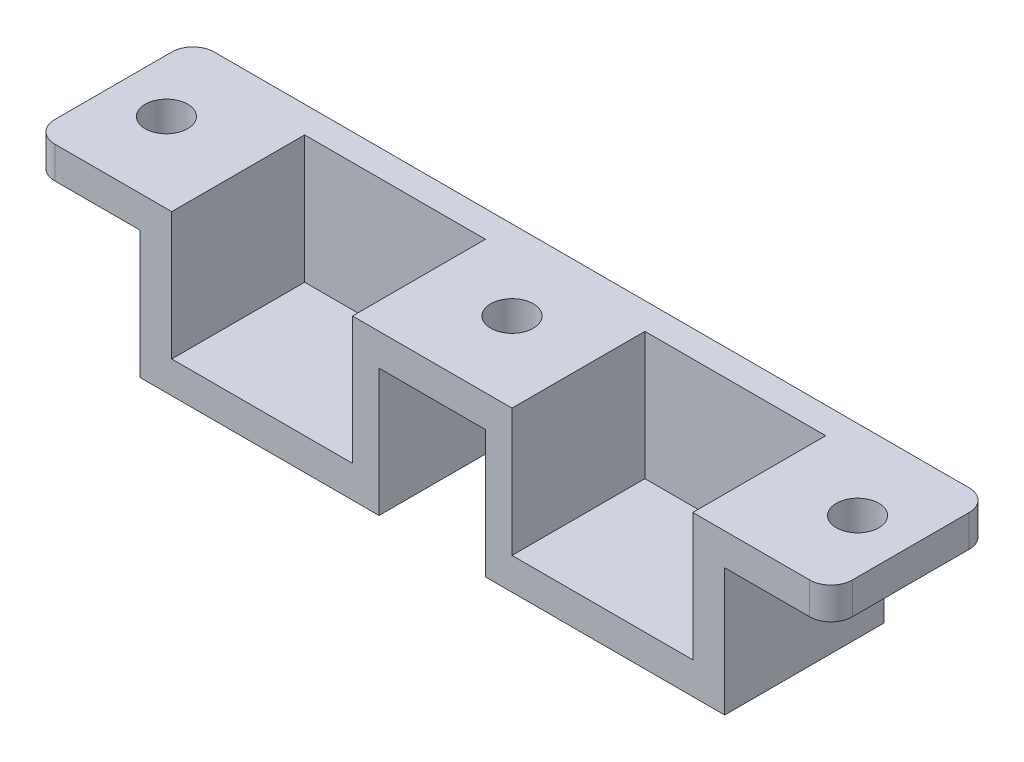
ISO-10303-21;
HEADER;
FILE_DESCRIPTION(('STEP AP214'),'2;1');
FILE_NAME('part.step','',(''),(''),'','','');
FILE_SCHEMA(('AUTOMOTIVE_DESIGN { 1 0 10303 214 1 1 1 1 }'));
ENDSEC;
DATA;
#1=APPLICATION_CONTEXT('core data for automotive mechanical design processes');
#2=APPLICATION_PROTOCOL_DEFINITION('international standard','automotive_design',2000,#1);
#3=PRODUCT_CONTEXT('',#1,'mechanical');
#4=PRODUCT('Part','Part','',(#3));
#5=PRODUCT_RELATED_PRODUCT_CATEGORY('part','',(#4));
#6=PRODUCT_DEFINITION_FORMATION('','',#4);
#7=PRODUCT_DEFINITION_CONTEXT('part definition',#1,'design');
#8=PRODUCT_DEFINITION('design','',#6,#7);
#9=PRODUCT_DEFINITION_SHAPE('','',#8);
#10=(LENGTH_UNIT() NAMED_UNIT(*) SI_UNIT(.MILLI.,.METRE.));
#11=(NAMED_UNIT(*) PLANE_ANGLE_UNIT() SI_UNIT($,.RADIAN.));
#12=(NAMED_UNIT(*) SI_UNIT($,.STERADIAN.) SOLID_ANGLE_UNIT());
#13=UNCERTAINTY_MEASURE_WITH_UNIT(LENGTH_MEASURE(1.E-05),#10,'distance_accuracy_value','');
#14=(GEOMETRIC_REPRESENTATION_CONTEXT(3) GLOBAL_UNCERTAINTY_ASSIGNED_CONTEXT((#13)) GLOBAL_UNIT_ASSIGNED_CONTEXT((#10,
#11,#12)) REPRESENTATION_CONTEXT('',''));
#15=CARTESIAN_POINT('',(0.,0.,0.));
#16=DIRECTION('',(0.,0.,1.));
#17=DIRECTION('',(1.,0.,0.));
#18=AXIS2_PLACEMENT_3D('',#15,#16,#17);
#19=CARTESIAN_POINT('',(37.5,15.,7.5));
#20=DIRECTION('',(-1.,0.,0.));
#21=DIRECTION('',(0.,0.,1.));
#22=AXIS2_PLACEMENT_3D('',#19,#20,#21);
#23=PLANE('',#22);
#24=DIRECTION('',(0.,0.,-1.));
#25=VECTOR('',#24,1.);
#26=CARTESIAN_POINT('',(37.5,15.,7.5));
#27=LINE('',#26,#25);
#28=CARTESIAN_POINT('',(37.5,15.,5.5));
#29=VERTEX_POINT('',#28);
#30=CARTESIAN_POINT('',(37.5,15.,-5.5));
#31=VERTEX_POINT('',#30);
#32=EDGE_CURVE('E334',#29,#31,#27,.T.);
#33=ORIENTED_EDGE('',*,*,#32,.F.);
#34=DIRECTION('',(0.,-1.,0.));
#35=VECTOR('',#34,1.);
#36=CARTESIAN_POINT('',(37.5,15.,5.5));
#37=LINE('',#36,#35);
#38=CARTESIAN_POINT('',(37.5,12.,5.5));
#39=VERTEX_POINT('',#38);
#40=EDGE_CURVE('E373',#29,#39,#37,.T.);
#41=ORIENTED_EDGE('',*,*,#40,.T.);
#42=DIRECTION('',(0.,0.,1.));
#43=VECTOR('',#42,1.);
#44=CARTESIAN_POINT('',(37.5,12.,-7.5));
#45=LINE('',#44,#43);
#46=CARTESIAN_POINT('',(37.5,12.,-5.5));
#47=VERTEX_POINT('',#46);
#48=EDGE_CURVE('E225',#47,#39,#45,.T.);
#49=ORIENTED_EDGE('',*,*,#48,.F.);
#50=DIRECTION('',(0.,-1.,0.));
#51=VECTOR('',#50,1.);
#52=CARTESIAN_POINT('',(37.5,15.,-5.5));
#53=LINE('',#52,#51);
#54=EDGE_CURVE('E371',#47,#31,#53,.F.);
#55=ORIENTED_EDGE('',*,*,#54,.T.);
#56=EDGE_LOOP('',(#33,#41,#49,#55));
#57=FACE_BOUND('',#56,.T.);
#58=ADVANCED_FACE('F33',(#57),#23,.F.);
#59=CARTESIAN_POINT('',(0.,0.,0.));
#60=DIRECTION('',(0.,1.,0.));
#61=DIRECTION('',(0.,0.,1.));
#62=AXIS2_PLACEMENT_3D('',#59,#60,#61);
#63=PLANE('',#62);
#64=DIRECTION('',(1.,0.,0.));
#65=VECTOR('',#64,1.);
#66=CARTESIAN_POINT('',(37.5,0.,7.5));
#67=LINE('',#66,#65);
#68=CARTESIAN_POINT('',(-27.5,0.,7.5));
#69=VERTEX_POINT('',#68);
#70=CARTESIAN_POINT('',(-5.,0.,7.5));
#71=VERTEX_POINT('',#70);
#72=EDGE_CURVE('E344',#69,#71,#67,.T.);
#73=ORIENTED_EDGE('',*,*,#72,.F.);
#74=DIRECTION('',(0.,0.,1.));
#75=VECTOR('',#74,1.);
#76=CARTESIAN_POINT('',(-27.5,0.,-7.49999999999999));
#77=LINE('',#76,#75);
#78=CARTESIAN_POINT('',(-27.5,0.,-7.49999999999999));
#79=VERTEX_POINT('',#78);
#80=EDGE_CURVE('E241',#79,#69,#77,.T.);
#81=ORIENTED_EDGE('',*,*,#80,.F.);
#82=DIRECTION('',(-1.,0.,0.));
#83=VECTOR('',#82,1.);
#84=CARTESIAN_POINT('',(37.5,0.,-7.5));
#85=LINE('',#84,#83);
#86=CARTESIAN_POINT('',(-5.,0.,-7.5));
#87=VERTEX_POINT('',#86);
#88=EDGE_CURVE('E218',#87,#79,#85,.T.);
#89=ORIENTED_EDGE('',*,*,#88,.F.);
#90=DIRECTION('',(0.,0.,-1.));
#91=VECTOR('',#90,1.);
#92=CARTESIAN_POINT('',(-5.,0.,-7.5));
#93=LINE('',#92,#91);
#94=EDGE_CURVE('E257',#71,#87,#93,.T.);
#95=ORIENTED_EDGE('',*,*,#94,.F.);
#96=EDGE_LOOP('',(#73,#81,#89,#95));
#97=FACE_BOUND('',#96,.T.);
#98=ADVANCED_FACE('F423',(#97),#63,.F.);
#99=CARTESIAN_POINT('',(-37.5,15.,7.5));
#100=DIRECTION('',(1.,0.,0.));
#101=DIRECTION('',(0.,0.,-1.));
#102=AXIS2_PLACEMENT_3D('',#99,#100,#101);
#103=PLANE('',#102);
#104=DIRECTION('',(0.,0.,1.));
#105=VECTOR('',#104,1.);
#106=CARTESIAN_POINT('',(-37.5,15.,7.5));
#107=LINE('',#106,#105);
#108=CARTESIAN_POINT('',(-37.5,15.,-5.49999999999999));
#109=VERTEX_POINT('',#108);
#110=CARTESIAN_POINT('',(-37.5,15.,5.5));
#111=VERTEX_POINT('',#110);
#112=EDGE_CURVE('E327',#109,#111,#107,.T.);
#113=ORIENTED_EDGE('',*,*,#112,.F.);
#114=DIRECTION('',(0.,-1.,0.));
#115=VECTOR('',#114,1.);
#116=CARTESIAN_POINT('',(-37.5,15.,-5.49999999999999));
#117=LINE('',#116,#115);
#118=CARTESIAN_POINT('',(-37.5,12.,-5.49999999999999));
#119=VERTEX_POINT('',#118);
#120=EDGE_CURVE('E347',#109,#119,#117,.T.);
#121=ORIENTED_EDGE('',*,*,#120,.T.);
#122=DIRECTION('',(0.,0.,-1.));
#123=VECTOR('',#122,1.);
#124=CARTESIAN_POINT('',(-37.5,12.,-7.49999999999999));
#125=LINE('',#124,#123);
#126=CARTESIAN_POINT('',(-37.5,12.,5.50000000000001));
#127=VERTEX_POINT('',#126);
#128=EDGE_CURVE('E204',#127,#119,#125,.T.);
#129=ORIENTED_EDGE('',*,*,#128,.F.);
#130=DIRECTION('',(0.,-1.,0.));
#131=VECTOR('',#130,1.);
#132=CARTESIAN_POINT('',(-37.5,15.,5.5));
#133=LINE('',#132,#131);
#134=EDGE_CURVE('E341',#127,#111,#133,.F.);
#135=ORIENTED_EDGE('',*,*,#134,.T.);
#136=EDGE_LOOP('',(#113,#121,#129,#135));
#137=FACE_BOUND('',#136,.T.);
#138=ADVANCED_FACE('F428',(#137),#103,.F.);
#139=CARTESIAN_POINT('',(37.5,15.,7.5));
#140=DIRECTION('',(0.,0.,-1.));
#141=DIRECTION('',(-1.,0.,0.));
#142=AXIS2_PLACEMENT_3D('',#139,#140,#141);
#143=PLANE('',#142);
#144=DIRECTION('',(1.,0.,0.));
#145=VECTOR('',#144,1.);
#146=CARTESIAN_POINT('',(37.5,15.,7.5));
#147=LINE('',#146,#145);
#148=CARTESIAN_POINT('',(-35.5,15.,7.5));
#149=VERTEX_POINT('',#148);
#150=CARTESIAN_POINT('',(-24.5,15.,7.5));
#151=VERTEX_POINT('',#150);
#152=EDGE_CURVE('E332',#149,#151,#147,.T.);
#153=ORIENTED_EDGE('',*,*,#152,.F.);
#154=DIRECTION('',(0.,-1.,0.));
#155=VECTOR('',#154,1.);
#156=CARTESIAN_POINT('',(-35.5,15.,7.5));
#157=LINE('',#156,#155);
#158=CARTESIAN_POINT('',(-35.5,12.,7.5));
#159=VERTEX_POINT('',#158);
#160=EDGE_CURVE('E368',#149,#159,#157,.T.);
#161=ORIENTED_EDGE('',*,*,#160,.T.);
#162=DIRECTION('',(-1.,0.,0.));
#163=VECTOR('',#162,1.);
#164=CARTESIAN_POINT('',(-37.5,12.,7.5));
#165=LINE('',#164,#163);
#166=CARTESIAN_POINT('',(-27.5,12.,7.5));
#167=VERTEX_POINT('',#166);
#168=EDGE_CURVE('E212',#167,#159,#165,.T.);
#169=ORIENTED_EDGE('',*,*,#168,.F.);
#170=DIRECTION('',(0.,-1.,0.));
#171=VECTOR('',#170,1.);
#172=CARTESIAN_POINT('',(-27.5,12.,7.5));
#173=LINE('',#172,#171);
#174=EDGE_CURVE('E211',#167,#69,#173,.T.);
#175=ORIENTED_EDGE('',*,*,#174,.T.);
#176=ORIENTED_EDGE('',*,*,#72,.T.);
#177=DIRECTION('',(0.,-1.,0.));
#178=VECTOR('',#177,1.);
#179=CARTESIAN_POINT('',(-5.,12.,7.5));
#180=LINE('',#179,#178);
#181=CARTESIAN_POINT('',(-5.,12.,7.5));
#182=VERTEX_POINT('',#181);
#183=EDGE_CURVE('E237',#182,#71,#180,.T.);
#184=ORIENTED_EDGE('',*,*,#183,.F.);
#185=DIRECTION('',(-1.,0.,0.));
#186=VECTOR('',#185,1.);
#187=CARTESIAN_POINT('',(5.,12.,7.5));
#188=LINE('',#187,#186);
#189=CARTESIAN_POINT('',(5.,12.,7.5));
#190=VERTEX_POINT('',#189);
#191=EDGE_CURVE('E253',#190,#182,#188,.T.);
#192=ORIENTED_EDGE('',*,*,#191,.F.);
#193=DIRECTION('',(0.,-1.,0.));
#194=VECTOR('',#193,1.);
#195=CARTESIAN_POINT('',(5.,12.,7.5));
#196=LINE('',#195,#194);
#197=CARTESIAN_POINT('',(5.,0.,7.5));
#198=VERTEX_POINT('',#197);
#199=EDGE_CURVE('E262',#190,#198,#196,.T.);
#200=ORIENTED_EDGE('',*,*,#199,.T.);
#201=CARTESIAN_POINT('',(27.5,0.,7.5));
#202=VERTEX_POINT('',#201);
#203=EDGE_CURVE('E293',#198,#202,#67,.T.);
#204=ORIENTED_EDGE('',*,*,#203,.T.);
#205=DIRECTION('',(0.,-1.,0.));
#206=VECTOR('',#205,1.);
#207=CARTESIAN_POINT('',(27.5,12.,7.5));
#208=LINE('',#207,#206);
#209=CARTESIAN_POINT('',(27.5,12.,7.5));
#210=VERTEX_POINT('',#209);
#211=EDGE_CURVE('E235',#210,#202,#208,.T.);
#212=ORIENTED_EDGE('',*,*,#211,.F.);
#213=DIRECTION('',(-1.,0.,0.));
#214=VECTOR('',#213,1.);
#215=CARTESIAN_POINT('',(37.5,12.,7.5));
#216=LINE('',#215,#214);
#217=CARTESIAN_POINT('',(35.5,12.,7.5));
#218=VERTEX_POINT('',#217);
#219=EDGE_CURVE('E227',#218,#210,#216,.T.);
#220=ORIENTED_EDGE('',*,*,#219,.F.);
#221=DIRECTION('',(0.,-1.,0.));
#222=VECTOR('',#221,1.);
#223=CARTESIAN_POINT('',(35.5,15.,7.5));
#224=LINE('',#223,#222);
#225=CARTESIAN_POINT('',(35.5,15.,7.5));
#226=VERTEX_POINT('',#225);
#227=EDGE_CURVE('E366',#218,#226,#224,.F.);
#228=ORIENTED_EDGE('',*,*,#227,.T.);
#229=CARTESIAN_POINT('',(24.5,15.,7.5));
#230=VERTEX_POINT('',#229);
#231=EDGE_CURVE('E330',#230,#226,#147,.T.);
#232=ORIENTED_EDGE('',*,*,#231,.F.);
#233=DIRECTION('',(0.,1.,0.));
#234=VECTOR('',#233,1.);
#235=CARTESIAN_POINT('',(24.5,3.,7.5));
#236=LINE('',#235,#234);
#237=CARTESIAN_POINT('',(24.5,3.,7.5));
#238=VERTEX_POINT('',#237);
#239=EDGE_CURVE('E323',#238,#230,#236,.T.);
#240=ORIENTED_EDGE('',*,*,#239,.F.);
#241=DIRECTION('',(1.,0.,0.));
#242=VECTOR('',#241,1.);
#243=CARTESIAN_POINT('',(7.5,3.,7.5));
#244=LINE('',#243,#242);
#245=CARTESIAN_POINT('',(7.5,3.,7.5));
#246=VERTEX_POINT('',#245);
#247=EDGE_CURVE('E303',#246,#238,#244,.T.);
#248=ORIENTED_EDGE('',*,*,#247,.F.);
#249=DIRECTION('',(0.,1.,0.));
#250=VECTOR('',#249,1.);
#251=CARTESIAN_POINT('',(7.5,3.,7.5));
#252=LINE('',#251,#250);
#253=CARTESIAN_POINT('',(7.5,15.,7.5));
#254=VERTEX_POINT('',#253);
#255=EDGE_CURVE('E313',#246,#254,#252,.T.);
#256=ORIENTED_EDGE('',*,*,#255,.T.);
#257=CARTESIAN_POINT('',(-7.5,15.,7.5));
#258=VERTEX_POINT('',#257);
#259=EDGE_CURVE('E335',#258,#254,#147,.T.);
#260=ORIENTED_EDGE('',*,*,#259,.F.);
#261=DIRECTION('',(0.,1.,0.));
#262=VECTOR('',#261,1.);
#263=CARTESIAN_POINT('',(-7.5,3.,7.5));
#264=LINE('',#263,#262);
#265=CARTESIAN_POINT('',(-7.5,3.,7.5));
#266=VERTEX_POINT('',#265);
#267=EDGE_CURVE('E296',#266,#258,#264,.T.);
#268=ORIENTED_EDGE('',*,*,#267,.F.);
#269=DIRECTION('',(1.,0.,0.));
#270=VECTOR('',#269,1.);
#271=CARTESIAN_POINT('',(-24.5,3.,7.5));
#272=LINE('',#271,#270);
#273=CARTESIAN_POINT('',(-24.5,3.,7.5));
#274=VERTEX_POINT('',#273);
#275=EDGE_CURVE('E271',#274,#266,#272,.T.);
#276=ORIENTED_EDGE('',*,*,#275,.F.);
#277=DIRECTION('',(0.,1.,0.));
#278=VECTOR('',#277,1.);
#279=CARTESIAN_POINT('',(-24.5,3.,7.5));
#280=LINE('',#279,#278);
#281=EDGE_CURVE('E281',#274,#151,#280,.T.);
#282=ORIENTED_EDGE('',*,*,#281,.T.);
#283=EDGE_LOOP('',(#153,#161,#169,#175,#176,#184,#192,#200,#204,#212,#220,#228,#232,#240,#248,
#256,#260,#268,#276,#282));
#284=FACE_BOUND('',#283,.T.);
#285=ADVANCED_FACE('F384',(#284),#143,.F.);
#286=CARTESIAN_POINT('',(37.5,15.,-7.5));
#287=DIRECTION('',(0.,0.,1.));
#288=DIRECTION('',(1.,0.,0.));
#289=AXIS2_PLACEMENT_3D('',#286,#287,#288);
#290=PLANE('',#289);
#291=DIRECTION('',(1.,0.,0.));
#292=VECTOR('',#291,1.);
#293=CARTESIAN_POINT('',(-37.5,12.,-7.49999999999999));
#294=LINE('',#293,#292);
#295=CARTESIAN_POINT('',(-35.5,12.,-7.49999999999999));
#296=VERTEX_POINT('',#295);
#297=CARTESIAN_POINT('',(-27.5,12.,-7.49999999999999));
#298=VERTEX_POINT('',#297);
#299=EDGE_CURVE('E193',#296,#298,#294,.T.);
#300=ORIENTED_EDGE('',*,*,#299,.F.);
#301=DIRECTION('',(0.,-1.,0.));
#302=VECTOR('',#301,1.);
#303=CARTESIAN_POINT('',(-35.5,15.,-7.49999999999999));
#304=LINE('',#303,#302);
#305=CARTESIAN_POINT('',(-35.5,15.,-7.49999999999999));
#306=VERTEX_POINT('',#305);
#307=EDGE_CURVE('E356',#296,#306,#304,.F.);
#308=ORIENTED_EDGE('',*,*,#307,.T.);
#309=DIRECTION('',(-1.,0.,0.));
#310=VECTOR('',#309,1.);
#311=CARTESIAN_POINT('',(37.5,15.,-7.5));
#312=LINE('',#311,#310);
#313=CARTESIAN_POINT('',(35.5,15.,-7.5));
#314=VERTEX_POINT('',#313);
#315=EDGE_CURVE('E338',#314,#306,#312,.T.);
#316=ORIENTED_EDGE('',*,*,#315,.F.);
#317=DIRECTION('',(0.,-1.,0.));
#318=VECTOR('',#317,1.);
#319=CARTESIAN_POINT('',(35.5,15.,-7.5));
#320=LINE('',#319,#318);
#321=CARTESIAN_POINT('',(35.5,12.,-7.5));
#322=VERTEX_POINT('',#321);
#323=EDGE_CURVE('E353',#314,#322,#320,.T.);
#324=ORIENTED_EDGE('',*,*,#323,.T.);
#325=DIRECTION('',(1.,0.,0.));
#326=VECTOR('',#325,1.);
#327=CARTESIAN_POINT('',(37.5,12.,-7.5));
#328=LINE('',#327,#326);
#329=CARTESIAN_POINT('',(27.5,12.,-7.49999999999999));
#330=VERTEX_POINT('',#329);
#331=EDGE_CURVE('E233',#330,#322,#328,.T.);
#332=ORIENTED_EDGE('',*,*,#331,.F.);
#333=DIRECTION('',(0.,-1.,0.));
#334=VECTOR('',#333,1.);
#335=CARTESIAN_POINT('',(27.5,12.,-7.49999999999999));
#336=LINE('',#335,#334);
#337=CARTESIAN_POINT('',(27.5,0.,-7.49999999999999));
#338=VERTEX_POINT('',#337);
#339=EDGE_CURVE('E238',#330,#338,#336,.T.);
#340=ORIENTED_EDGE('',*,*,#339,.T.);
#341=CARTESIAN_POINT('',(5.,0.,-7.5));
#342=VERTEX_POINT('',#341);
#343=EDGE_CURVE('E331',#338,#342,#85,.T.);
#344=ORIENTED_EDGE('',*,*,#343,.T.);
#345=DIRECTION('',(0.,-1.,0.));
#346=VECTOR('',#345,1.);
#347=CARTESIAN_POINT('',(5.,12.,-7.5));
#348=LINE('',#347,#346);
#349=CARTESIAN_POINT('',(5.,12.,-7.5));
#350=VERTEX_POINT('',#349);
#351=EDGE_CURVE('E265',#350,#342,#348,.T.);
#352=ORIENTED_EDGE('',*,*,#351,.F.);
#353=DIRECTION('',(1.,0.,0.));
#354=VECTOR('',#353,1.);
#355=CARTESIAN_POINT('',(5.,12.,-7.5));
#356=LINE('',#355,#354);
#357=CARTESIAN_POINT('',(-5.,12.,-7.5));
#358=VERTEX_POINT('',#357);
#359=EDGE_CURVE('E246',#358,#350,#356,.T.);
#360=ORIENTED_EDGE('',*,*,#359,.F.);
#361=DIRECTION('',(0.,-1.,0.));
#362=VECTOR('',#361,1.);
#363=CARTESIAN_POINT('',(-5.,12.,-7.5));
#364=LINE('',#363,#362);
#365=EDGE_CURVE('E256',#358,#87,#364,.T.);
#366=ORIENTED_EDGE('',*,*,#365,.T.);
#367=ORIENTED_EDGE('',*,*,#88,.T.);
#368=DIRECTION('',(0.,-1.,0.));
#369=VECTOR('',#368,1.);
#370=CARTESIAN_POINT('',(-27.5,12.,-7.49999999999999));
#371=LINE('',#370,#369);
#372=EDGE_CURVE('E208',#298,#79,#371,.T.);
#373=ORIENTED_EDGE('',*,*,#372,.F.);
#374=EDGE_LOOP('',(#300,#308,#316,#324,#332,#340,#344,#352,#360,#366,#367,#373));
#375=FACE_BOUND('',#374,.T.);
#376=ADVANCED_FACE('F215',(#375),#290,.F.);
#377=CARTESIAN_POINT('',(0.,15.,0.));
#378=DIRECTION('',(0.,1.,0.));
#379=DIRECTION('',(0.,0.,1.));
#380=AXIS2_PLACEMENT_3D('',#377,#378,#379);
#381=PLANE('',#380);
#382=CARTESIAN_POINT('',(-32.5,15.,0.));
#383=DIRECTION('',(0.,-1.,0.));
#384=DIRECTION('',(0.,0.,-1.));
#385=AXIS2_PLACEMENT_3D('',#382,#383,#384);
#386=CIRCLE('',#385,2.);
#387=CARTESIAN_POINT('',(-32.5,15.,-2.));
#388=VERTEX_POINT('',#387);
#389=EDGE_CURVE('E673',#388,#388,#386,.T.);
#390=ORIENTED_EDGE('',*,*,#389,.T.);
#391=EDGE_LOOP('',(#390));
#392=FACE_BOUND('',#391,.T.);
#393=CARTESIAN_POINT('',(0.,15.,0.));
#394=DIRECTION('',(0.,-1.,0.));
#395=DIRECTION('',(0.,0.,-1.));
#396=AXIS2_PLACEMENT_3D('',#393,#394,#395);
#397=CIRCLE('',#396,2.);
#398=CARTESIAN_POINT('',(0.,15.,-2.));
#399=VERTEX_POINT('',#398);
#400=EDGE_CURVE('E681',#399,#399,#397,.T.);
#401=ORIENTED_EDGE('',*,*,#400,.T.);
#402=EDGE_LOOP('',(#401));
#403=FACE_BOUND('',#402,.T.);
#404=CARTESIAN_POINT('',(32.5,15.,0.));
#405=DIRECTION('',(0.,-1.,0.));
#406=DIRECTION('',(0.,0.,-1.));
#407=AXIS2_PLACEMENT_3D('',#404,#405,#406);
#408=CIRCLE('',#407,2.);
#409=CARTESIAN_POINT('',(32.5,15.,-2.));
#410=VERTEX_POINT('',#409);
#411=EDGE_CURVE('E259',#410,#410,#408,.T.);
#412=ORIENTED_EDGE('',*,*,#411,.T.);
#413=EDGE_LOOP('',(#412));
#414=FACE_BOUND('',#413,.T.);
#415=ORIENTED_EDGE('',*,*,#315,.T.);
#416=CARTESIAN_POINT('',(-35.5,15.,-5.49999999999999));
#417=DIRECTION('',(0.,1.,0.));
#418=DIRECTION('',(0.,0.,1.));
#419=AXIS2_PLACEMENT_3D('',#416,#417,#418);
#420=CIRCLE('',#419,2.);
#421=EDGE_CURVE('E364',#306,#109,#420,.T.);
#422=ORIENTED_EDGE('',*,*,#421,.T.);
#423=ORIENTED_EDGE('',*,*,#112,.T.);
#424=CARTESIAN_POINT('',(-35.5,15.,5.5));
#425=DIRECTION('',(0.,1.,0.));
#426=DIRECTION('',(0.,0.,1.));
#427=AXIS2_PLACEMENT_3D('',#424,#425,#426);
#428=CIRCLE('',#427,2.);
#429=EDGE_CURVE('E362',#111,#149,#428,.T.);
#430=ORIENTED_EDGE('',*,*,#429,.T.);
#431=ORIENTED_EDGE('',*,*,#152,.T.);
#432=DIRECTION('',(0.,0.,1.));
#433=VECTOR('',#432,1.);
#434=CARTESIAN_POINT('',(-24.5,15.,7.5));
#435=LINE('',#434,#433);
#436=CARTESIAN_POINT('',(-24.5,15.,-5.));
#437=VERTEX_POINT('',#436);
#438=EDGE_CURVE('E282',#437,#151,#435,.T.);
#439=ORIENTED_EDGE('',*,*,#438,.F.);
#440=DIRECTION('',(-1.,0.,0.));
#441=VECTOR('',#440,1.);
#442=CARTESIAN_POINT('',(-24.5,15.,-5.));
#443=LINE('',#442,#441);
#444=CARTESIAN_POINT('',(-7.5,15.,-5.));
#445=VERTEX_POINT('',#444);
#446=EDGE_CURVE('E272',#445,#437,#443,.T.);
#447=ORIENTED_EDGE('',*,*,#446,.F.);
#448=DIRECTION('',(0.,0.,-1.));
#449=VECTOR('',#448,1.);
#450=CARTESIAN_POINT('',(-7.5,15.,7.5));
#451=LINE('',#450,#449);
#452=EDGE_CURVE('E285',#258,#445,#451,.T.);
#453=ORIENTED_EDGE('',*,*,#452,.F.);
#454=ORIENTED_EDGE('',*,*,#259,.T.);
#455=DIRECTION('',(0.,0.,1.));
#456=VECTOR('',#455,1.);
#457=CARTESIAN_POINT('',(7.5,15.,7.5));
#458=LINE('',#457,#456);
#459=CARTESIAN_POINT('',(7.5,15.,-5.));
#460=VERTEX_POINT('',#459);
#461=EDGE_CURVE('E220',#460,#254,#458,.T.);
#462=ORIENTED_EDGE('',*,*,#461,.F.);
#463=DIRECTION('',(-1.,0.,0.));
#464=VECTOR('',#463,1.);
#465=CARTESIAN_POINT('',(7.5,15.,-5.));
#466=LINE('',#465,#464);
#467=CARTESIAN_POINT('',(24.5,15.,-5.));
#468=VERTEX_POINT('',#467);
#469=EDGE_CURVE('E304',#468,#460,#466,.T.);
#470=ORIENTED_EDGE('',*,*,#469,.F.);
#471=DIRECTION('',(0.,0.,-1.));
#472=VECTOR('',#471,1.);
#473=CARTESIAN_POINT('',(24.5,15.,7.5));
#474=LINE('',#473,#472);
#475=EDGE_CURVE('E315',#230,#468,#474,.T.);
#476=ORIENTED_EDGE('',*,*,#475,.F.);
#477=ORIENTED_EDGE('',*,*,#231,.T.);
#478=CARTESIAN_POINT('',(35.5,15.,5.5));
#479=DIRECTION('',(0.,1.,0.));
#480=DIRECTION('',(0.,0.,1.));
#481=AXIS2_PLACEMENT_3D('',#478,#479,#480);
#482=CIRCLE('',#481,2.);
#483=EDGE_CURVE('E360',#226,#29,#482,.T.);
#484=ORIENTED_EDGE('',*,*,#483,.T.);
#485=ORIENTED_EDGE('',*,*,#32,.T.);
#486=CARTESIAN_POINT('',(35.5,15.,-5.5));
#487=DIRECTION('',(0.,1.,0.));
#488=DIRECTION('',(0.,0.,1.));
#489=AXIS2_PLACEMENT_3D('',#486,#487,#488);
#490=CIRCLE('',#489,2.);
#491=EDGE_CURVE('E358',#31,#314,#490,.T.);
#492=ORIENTED_EDGE('',*,*,#491,.T.);
#493=EDGE_LOOP('',(#415,#422,#423,#430,#431,#439,#447,#453,#454,#462,#470,#476,#477,#484,#485,#492));
#494=FACE_BOUND('',#493,.T.);
#495=ADVANCED_FACE('F389',(#392,#403,#414,#494),#381,.T.);
#496=ORIENTED_EDGE('',*,*,#343,.F.);
#497=DIRECTION('',(0.,0.,-1.));
#498=VECTOR('',#497,1.);
#499=CARTESIAN_POINT('',(27.5,0.,-7.49999999999999));
#500=LINE('',#499,#498);
#501=EDGE_CURVE('E228',#202,#338,#500,.T.);
#502=ORIENTED_EDGE('',*,*,#501,.F.);
#503=ORIENTED_EDGE('',*,*,#203,.F.);
#504=DIRECTION('',(0.,0.,1.));
#505=VECTOR('',#504,1.);
#506=CARTESIAN_POINT('',(5.,0.,-7.5));
#507=LINE('',#506,#505);
#508=EDGE_CURVE('E247',#342,#198,#507,.T.);
#509=ORIENTED_EDGE('',*,*,#508,.F.);
#510=EDGE_LOOP('',(#496,#502,#503,#509));
#511=FACE_BOUND('',#510,.T.);
#512=ADVANCED_FACE('F431',(#511),#63,.F.);
#513=CARTESIAN_POINT('',(7.5,3.,7.5));
#514=DIRECTION('',(-1.,0.,0.));
#515=DIRECTION('',(0.,0.,1.));
#516=AXIS2_PLACEMENT_3D('',#513,#514,#515);
#517=PLANE('',#516);
#518=ORIENTED_EDGE('',*,*,#461,.T.);
#519=ORIENTED_EDGE('',*,*,#255,.F.);
#520=DIRECTION('',(0.,0.,1.));
#521=VECTOR('',#520,1.);
#522=CARTESIAN_POINT('',(7.5,3.,7.5));
#523=LINE('',#522,#521);
#524=CARTESIAN_POINT('',(7.5,3.,-5.));
#525=VERTEX_POINT('',#524);
#526=EDGE_CURVE('E300',#525,#246,#523,.T.);
#527=ORIENTED_EDGE('',*,*,#526,.F.);
#528=DIRECTION('',(0.,1.,0.));
#529=VECTOR('',#528,1.);
#530=CARTESIAN_POINT('',(7.5,3.,-5.));
#531=LINE('',#530,#529);
#532=EDGE_CURVE('E286',#525,#460,#531,.T.);
#533=ORIENTED_EDGE('',*,*,#532,.T.);
#534=EDGE_LOOP('',(#518,#519,#527,#533));
#535=FACE_BOUND('',#534,.T.);
#536=ADVANCED_FACE('F404',(#535),#517,.F.);
#537=CARTESIAN_POINT('',(7.5,3.,-5.));
#538=DIRECTION('',(0.,0.,-1.));
#539=DIRECTION('',(-1.,0.,0.));
#540=AXIS2_PLACEMENT_3D('',#537,#538,#539);
#541=PLANE('',#540);
#542=ORIENTED_EDGE('',*,*,#469,.T.);
#543=ORIENTED_EDGE('',*,*,#532,.F.);
#544=DIRECTION('',(-1.,0.,0.));
#545=VECTOR('',#544,1.);
#546=CARTESIAN_POINT('',(7.5,3.,-5.));
#547=LINE('',#546,#545);
#548=CARTESIAN_POINT('',(24.5,3.,-5.));
#549=VERTEX_POINT('',#548);
#550=EDGE_CURVE('E310',#549,#525,#547,.T.);
#551=ORIENTED_EDGE('',*,*,#550,.F.);
#552=DIRECTION('',(0.,1.,0.));
#553=VECTOR('',#552,1.);
#554=CARTESIAN_POINT('',(24.5,3.,-5.));
#555=LINE('',#554,#553);
#556=EDGE_CURVE('E321',#549,#468,#555,.T.);
#557=ORIENTED_EDGE('',*,*,#556,.T.);
#558=EDGE_LOOP('',(#542,#543,#551,#557));
#559=FACE_BOUND('',#558,.T.);
#560=ADVANCED_FACE('F409',(#559),#541,.F.);
#561=CARTESIAN_POINT('',(24.5,3.,7.5));
#562=DIRECTION('',(1.,0.,0.));
#563=DIRECTION('',(0.,0.,-1.));
#564=AXIS2_PLACEMENT_3D('',#561,#562,#563);
#565=PLANE('',#564);
#566=ORIENTED_EDGE('',*,*,#475,.T.);
#567=ORIENTED_EDGE('',*,*,#556,.F.);
#568=DIRECTION('',(0.,0.,-1.));
#569=VECTOR('',#568,1.);
#570=CARTESIAN_POINT('',(24.5,3.,7.5));
#571=LINE('',#570,#569);
#572=EDGE_CURVE('E307',#238,#549,#571,.T.);
#573=ORIENTED_EDGE('',*,*,#572,.F.);
#574=ORIENTED_EDGE('',*,*,#239,.T.);
#575=EDGE_LOOP('',(#566,#567,#573,#574));
#576=FACE_BOUND('',#575,.T.);
#577=ADVANCED_FACE('F411',(#576),#565,.F.);
#578=CARTESIAN_POINT('',(0.,3.,0.));
#579=DIRECTION('',(0.,-1.,0.));
#580=DIRECTION('',(0.,0.,-1.));
#581=AXIS2_PLACEMENT_3D('',#578,#579,#580);
#582=PLANE('',#581);
#583=ORIENTED_EDGE('',*,*,#526,.T.);
#584=ORIENTED_EDGE('',*,*,#247,.T.);
#585=ORIENTED_EDGE('',*,*,#572,.T.);
#586=ORIENTED_EDGE('',*,*,#550,.T.);
#587=EDGE_LOOP('',(#583,#584,#585,#586));
#588=FACE_BOUND('',#587,.T.);
#589=ADVANCED_FACE('F406',(#588),#582,.F.);
#590=CARTESIAN_POINT('',(-24.5,3.,7.5));
#591=DIRECTION('',(-1.,0.,0.));
#592=DIRECTION('',(0.,0.,1.));
#593=AXIS2_PLACEMENT_3D('',#590,#591,#592);
#594=PLANE('',#593);
#595=ORIENTED_EDGE('',*,*,#438,.T.);
#596=ORIENTED_EDGE('',*,*,#281,.F.);
#597=DIRECTION('',(0.,0.,1.));
#598=VECTOR('',#597,1.);
#599=CARTESIAN_POINT('',(-24.5,3.,7.5));
#600=LINE('',#599,#598);
#601=CARTESIAN_POINT('',(-24.5,3.,-5.));
#602=VERTEX_POINT('',#601);
#603=EDGE_CURVE('E268',#602,#274,#600,.T.);
#604=ORIENTED_EDGE('',*,*,#603,.F.);
#605=DIRECTION('',(0.,1.,0.));
#606=VECTOR('',#605,1.);
#607=CARTESIAN_POINT('',(-24.5,3.,-5.));
#608=LINE('',#607,#606);
#609=EDGE_CURVE('E291',#602,#437,#608,.T.);
#610=ORIENTED_EDGE('',*,*,#609,.T.);
#611=EDGE_LOOP('',(#595,#596,#604,#610));
#612=FACE_BOUND('',#611,.T.);
#613=ADVANCED_FACE('F418',(#612),#594,.F.);
#614=CARTESIAN_POINT('',(-24.5,3.,-5.));
#615=DIRECTION('',(0.,0.,-1.));
#616=DIRECTION('',(-1.,0.,0.));
#617=AXIS2_PLACEMENT_3D('',#614,#615,#616);
#618=PLANE('',#617);
#619=ORIENTED_EDGE('',*,*,#446,.T.);
#620=ORIENTED_EDGE('',*,*,#609,.F.);
#621=DIRECTION('',(-1.,0.,0.));
#622=VECTOR('',#621,1.);
#623=CARTESIAN_POINT('',(-24.5,3.,-5.));
#624=LINE('',#623,#622);
#625=CARTESIAN_POINT('',(-7.5,3.,-5.));
#626=VERTEX_POINT('',#625);
#627=EDGE_CURVE('E278',#626,#602,#624,.T.);
#628=ORIENTED_EDGE('',*,*,#627,.F.);
#629=DIRECTION('',(0.,1.,0.));
#630=VECTOR('',#629,1.);
#631=CARTESIAN_POINT('',(-7.5,3.,-5.));
#632=LINE('',#631,#630);
#633=EDGE_CURVE('E294',#626,#445,#632,.T.);
#634=ORIENTED_EDGE('',*,*,#633,.T.);
#635=EDGE_LOOP('',(#619,#620,#628,#634));
#636=FACE_BOUND('',#635,.T.);
#637=ADVANCED_FACE('F471',(#636),#618,.F.);
#638=CARTESIAN_POINT('',(-7.5,3.,7.5));
#639=DIRECTION('',(1.,0.,0.));
#640=DIRECTION('',(0.,0.,-1.));
#641=AXIS2_PLACEMENT_3D('',#638,#639,#640);
#642=PLANE('',#641);
#643=ORIENTED_EDGE('',*,*,#452,.T.);
#644=ORIENTED_EDGE('',*,*,#633,.F.);
#645=DIRECTION('',(0.,0.,-1.));
#646=VECTOR('',#645,1.);
#647=CARTESIAN_POINT('',(-7.5,3.,7.5));
#648=LINE('',#647,#646);
#649=EDGE_CURVE('E275',#266,#626,#648,.T.);
#650=ORIENTED_EDGE('',*,*,#649,.F.);
#651=ORIENTED_EDGE('',*,*,#267,.T.);
#652=EDGE_LOOP('',(#643,#644,#650,#651));
#653=FACE_BOUND('',#652,.T.);
#654=ADVANCED_FACE('F473',(#653),#642,.F.);
#655=CARTESIAN_POINT('',(0.,3.,0.));
#656=DIRECTION('',(0.,-1.,0.));
#657=DIRECTION('',(0.,0.,-1.));
#658=AXIS2_PLACEMENT_3D('',#655,#656,#657);
#659=PLANE('',#658);
#660=ORIENTED_EDGE('',*,*,#603,.T.);
#661=ORIENTED_EDGE('',*,*,#275,.T.);
#662=ORIENTED_EDGE('',*,*,#649,.T.);
#663=ORIENTED_EDGE('',*,*,#627,.T.);
#664=EDGE_LOOP('',(#660,#661,#662,#663));
#665=FACE_BOUND('',#664,.T.);
#666=ADVANCED_FACE('F468',(#665),#659,.F.);
#667=CARTESIAN_POINT('',(-5.,12.,-7.5));
#668=DIRECTION('',(-1.,0.,0.));
#669=DIRECTION('',(0.,0.,1.));
#670=AXIS2_PLACEMENT_3D('',#667,#668,#669);
#671=PLANE('',#670);
#672=ORIENTED_EDGE('',*,*,#94,.T.);
#673=ORIENTED_EDGE('',*,*,#365,.F.);
#674=DIRECTION('',(0.,0.,-1.));
#675=VECTOR('',#674,1.);
#676=CARTESIAN_POINT('',(-5.,12.,-7.5));
#677=LINE('',#676,#675);
#678=EDGE_CURVE('E243',#182,#358,#677,.T.);
#679=ORIENTED_EDGE('',*,*,#678,.F.);
#680=ORIENTED_EDGE('',*,*,#183,.T.);
#681=EDGE_LOOP('',(#672,#673,#679,#680));
#682=FACE_BOUND('',#681,.T.);
#683=ADVANCED_FACE('F480',(#682),#671,.F.);
#684=CARTESIAN_POINT('',(5.,12.,-7.5));
#685=DIRECTION('',(1.,0.,0.));
#686=DIRECTION('',(0.,0.,-1.));
#687=AXIS2_PLACEMENT_3D('',#684,#685,#686);
#688=PLANE('',#687);
#689=ORIENTED_EDGE('',*,*,#508,.T.);
#690=ORIENTED_EDGE('',*,*,#199,.F.);
#691=DIRECTION('',(0.,0.,1.));
#692=VECTOR('',#691,1.);
#693=CARTESIAN_POINT('',(5.,12.,-7.5));
#694=LINE('',#693,#692);
#695=EDGE_CURVE('E250',#350,#190,#694,.T.);
#696=ORIENTED_EDGE('',*,*,#695,.F.);
#697=ORIENTED_EDGE('',*,*,#351,.T.);
#698=EDGE_LOOP('',(#689,#690,#696,#697));
#699=FACE_BOUND('',#698,.T.);
#700=ADVANCED_FACE('F531',(#699),#688,.F.);
#701=CARTESIAN_POINT('',(0.,12.,0.));
#702=DIRECTION('',(0.,-1.,0.));
#703=DIRECTION('',(0.,0.,-1.));
#704=AXIS2_PLACEMENT_3D('',#701,#702,#703);
#705=PLANE('',#704);
#706=CARTESIAN_POINT('',(0.,12.,0.));
#707=DIRECTION('',(0.,-1.,0.));
#708=DIRECTION('',(0.,0.,-1.));
#709=AXIS2_PLACEMENT_3D('',#706,#707,#708);
#710=CIRCLE('',#709,2.);
#711=CARTESIAN_POINT('',(0.,12.,-2.));
#712=VERTEX_POINT('',#711);
#713=EDGE_CURVE('E676',#712,#712,#710,.T.);
#714=ORIENTED_EDGE('',*,*,#713,.F.);
#715=EDGE_LOOP('',(#714));
#716=FACE_BOUND('',#715,.T.);
#717=ORIENTED_EDGE('',*,*,#678,.T.);
#718=ORIENTED_EDGE('',*,*,#359,.T.);
#719=ORIENTED_EDGE('',*,*,#695,.T.);
#720=ORIENTED_EDGE('',*,*,#191,.T.);
#721=EDGE_LOOP('',(#717,#718,#719,#720));
#722=FACE_BOUND('',#721,.T.);
#723=ADVANCED_FACE('F541',(#716,#722),#705,.T.);
#724=CARTESIAN_POINT('',(27.5,12.,-7.49999999999999));
#725=DIRECTION('',(-1.,0.,0.));
#726=DIRECTION('',(0.,0.,1.));
#727=AXIS2_PLACEMENT_3D('',#724,#725,#726);
#728=PLANE('',#727);
#729=ORIENTED_EDGE('',*,*,#501,.T.);
#730=ORIENTED_EDGE('',*,*,#339,.F.);
#731=DIRECTION('',(0.,0.,-1.));
#732=VECTOR('',#731,1.);
#733=CARTESIAN_POINT('',(27.5,12.,-7.49999999999999));
#734=LINE('',#733,#732);
#735=EDGE_CURVE('E230',#210,#330,#734,.T.);
#736=ORIENTED_EDGE('',*,*,#735,.F.);
#737=ORIENTED_EDGE('',*,*,#211,.T.);
#738=EDGE_LOOP('',(#729,#730,#736,#737));
#739=FACE_BOUND('',#738,.T.);
#740=ADVANCED_FACE('F549',(#739),#728,.F.);
#741=CARTESIAN_POINT('',(0.,12.,0.));
#742=DIRECTION('',(0.,-1.,0.));
#743=DIRECTION('',(0.,0.,-1.));
#744=AXIS2_PLACEMENT_3D('',#741,#742,#743);
#745=PLANE('',#744);
#746=CARTESIAN_POINT('',(32.5,12.,0.));
#747=DIRECTION('',(0.,-1.,0.));
#748=DIRECTION('',(0.,0.,-1.));
#749=AXIS2_PLACEMENT_3D('',#746,#747,#748);
#750=CIRCLE('',#749,2.);
#751=CARTESIAN_POINT('',(32.5,12.,-2.));
#752=VERTEX_POINT('',#751);
#753=EDGE_CURVE('E684',#752,#752,#750,.T.);
#754=ORIENTED_EDGE('',*,*,#753,.F.);
#755=EDGE_LOOP('',(#754));
#756=FACE_BOUND('',#755,.T.);
#757=ORIENTED_EDGE('',*,*,#48,.T.);
#758=CARTESIAN_POINT('',(35.5,12.,5.5));
#759=DIRECTION('',(0.,-1.,0.));
#760=DIRECTION('',(0.,0.,-1.));
#761=AXIS2_PLACEMENT_3D('',#758,#759,#760);
#762=CIRCLE('',#761,2.);
#763=EDGE_CURVE('E11',#39,#218,#762,.T.);
#764=ORIENTED_EDGE('',*,*,#763,.T.);
#765=ORIENTED_EDGE('',*,*,#219,.T.);
#766=ORIENTED_EDGE('',*,*,#735,.T.);
#767=ORIENTED_EDGE('',*,*,#331,.T.);
#768=CARTESIAN_POINT('',(35.5,12.,-5.5));
#769=DIRECTION('',(0.,-1.,0.));
#770=DIRECTION('',(0.,0.,-1.));
#771=AXIS2_PLACEMENT_3D('',#768,#769,#770);
#772=CIRCLE('',#771,2.);
#773=EDGE_CURVE('E41',#322,#47,#772,.T.);
#774=ORIENTED_EDGE('',*,*,#773,.T.);
#775=EDGE_LOOP('',(#757,#764,#765,#766,#767,#774));
#776=FACE_BOUND('',#775,.T.);
#777=ADVANCED_FACE('F378',(#756,#776),#745,.T.);
#778=CARTESIAN_POINT('',(-27.5,12.,-7.49999999999999));
#779=DIRECTION('',(1.,0.,0.));
#780=DIRECTION('',(0.,0.,-1.));
#781=AXIS2_PLACEMENT_3D('',#778,#779,#780);
#782=PLANE('',#781);
#783=ORIENTED_EDGE('',*,*,#80,.T.);
#784=ORIENTED_EDGE('',*,*,#174,.F.);
#785=DIRECTION('',(0.,0.,1.));
#786=VECTOR('',#785,1.);
#787=CARTESIAN_POINT('',(-27.5,12.,-7.49999999999999));
#788=LINE('',#787,#786);
#789=EDGE_CURVE('E198',#298,#167,#788,.T.);
#790=ORIENTED_EDGE('',*,*,#789,.F.);
#791=ORIENTED_EDGE('',*,*,#372,.T.);
#792=EDGE_LOOP('',(#783,#784,#790,#791));
#793=FACE_BOUND('',#792,.T.);
#794=ADVANCED_FACE('F207',(#793),#782,.F.);
#795=CARTESIAN_POINT('',(0.,12.,0.));
#796=DIRECTION('',(0.,1.,0.));
#797=DIRECTION('',(0.,0.,1.));
#798=AXIS2_PLACEMENT_3D('',#795,#796,#797);
#799=PLANE('',#798);
#800=CARTESIAN_POINT('',(-32.5,12.,0.));
#801=DIRECTION('',(0.,-1.,0.));
#802=DIRECTION('',(0.,0.,-1.));
#803=AXIS2_PLACEMENT_3D('',#800,#801,#802);
#804=CIRCLE('',#803,2.);
#805=CARTESIAN_POINT('',(-32.5,12.,-2.));
#806=VERTEX_POINT('',#805);
#807=EDGE_CURVE('E671',#806,#806,#804,.T.);
#808=ORIENTED_EDGE('',*,*,#807,.F.);
#809=EDGE_LOOP('',(#808));
#810=FACE_BOUND('',#809,.T.);
#811=ORIENTED_EDGE('',*,*,#128,.T.);
#812=CARTESIAN_POINT('',(-35.5,12.,-5.49999999999999));
#813=DIRECTION('',(0.,1.,0.));
#814=DIRECTION('',(0.,0.,1.));
#815=AXIS2_PLACEMENT_3D('',#812,#813,#814);
#816=CIRCLE('',#815,2.);
#817=EDGE_CURVE('E200',#119,#296,#816,.F.);
#818=ORIENTED_EDGE('',*,*,#817,.T.);
#819=ORIENTED_EDGE('',*,*,#299,.T.);
#820=ORIENTED_EDGE('',*,*,#789,.T.);
#821=ORIENTED_EDGE('',*,*,#168,.T.);
#822=CARTESIAN_POINT('',(-35.5,12.,5.5));
#823=DIRECTION('',(0.,1.,0.));
#824=DIRECTION('',(0.,0.,1.));
#825=AXIS2_PLACEMENT_3D('',#822,#823,#824);
#826=CIRCLE('',#825,2.);
#827=EDGE_CURVE('E350',#159,#127,#826,.F.);
#828=ORIENTED_EDGE('',*,*,#827,.T.);
#829=EDGE_LOOP('',(#811,#818,#819,#820,#821,#828));
#830=FACE_BOUND('',#829,.T.);
#831=ADVANCED_FACE('F196',(#810,#830),#799,.F.);
#832=CARTESIAN_POINT('',(32.5,12.,0.));
#833=DIRECTION('',(0.,-1.,0.));
#834=DIRECTION('',(0.,0.,-1.));
#835=AXIS2_PLACEMENT_3D('',#832,#833,#834);
#836=CYLINDRICAL_SURFACE('',#835,2.);
#837=ORIENTED_EDGE('',*,*,#411,.F.);
#838=EDGE_LOOP('',(#837));
#839=FACE_BOUND('',#838,.T.);
#840=ORIENTED_EDGE('',*,*,#753,.T.);
#841=EDGE_LOOP('',(#840));
#842=FACE_BOUND('',#841,.T.);
#843=ADVANCED_FACE('F578',(#839,#842),#836,.F.);
#844=CARTESIAN_POINT('',(0.,12.,0.));
#845=DIRECTION('',(0.,-1.,0.));
#846=DIRECTION('',(0.,0.,-1.));
#847=AXIS2_PLACEMENT_3D('',#844,#845,#846);
#848=CYLINDRICAL_SURFACE('',#847,2.);
#849=ORIENTED_EDGE('',*,*,#400,.F.);
#850=EDGE_LOOP('',(#849));
#851=FACE_BOUND('',#850,.T.);
#852=ORIENTED_EDGE('',*,*,#713,.T.);
#853=EDGE_LOOP('',(#852));
#854=FACE_BOUND('',#853,.T.);
#855=ADVANCED_FACE('F583',(#851,#854),#848,.F.);
#856=CARTESIAN_POINT('',(-32.5,12.,0.));
#857=DIRECTION('',(0.,-1.,0.));
#858=DIRECTION('',(0.,0.,-1.));
#859=AXIS2_PLACEMENT_3D('',#856,#857,#858);
#860=CYLINDRICAL_SURFACE('',#859,2.);
#861=ORIENTED_EDGE('',*,*,#389,.F.);
#862=EDGE_LOOP('',(#861));
#863=FACE_BOUND('',#862,.T.);
#864=ORIENTED_EDGE('',*,*,#807,.T.);
#865=EDGE_LOOP('',(#864));
#866=FACE_BOUND('',#865,.T.);
#867=ADVANCED_FACE('F443',(#863,#866),#860,.F.);
#868=CARTESIAN_POINT('',(-35.5,15.,-5.49999999999999));
#869=DIRECTION('',(0.,-1.,0.));
#870=DIRECTION('',(0.,0.,-1.));
#871=AXIS2_PLACEMENT_3D('',#868,#869,#870);
#872=CYLINDRICAL_SURFACE('',#871,2.);
#873=ORIENTED_EDGE('',*,*,#421,.F.);
#874=ORIENTED_EDGE('',*,*,#307,.F.);
#875=ORIENTED_EDGE('',*,*,#817,.F.);
#876=ORIENTED_EDGE('',*,*,#120,.F.);
#877=EDGE_LOOP('',(#873,#874,#875,#876));
#878=FACE_BOUND('',#877,.T.);
#879=ADVANCED_FACE('F439',(#878),#872,.T.);
#880=CARTESIAN_POINT('',(-35.5,15.,5.5));
#881=DIRECTION('',(0.,-1.,0.));
#882=DIRECTION('',(0.,0.,-1.));
#883=AXIS2_PLACEMENT_3D('',#880,#881,#882);
#884=CYLINDRICAL_SURFACE('',#883,2.);
#885=ORIENTED_EDGE('',*,*,#429,.F.);
#886=ORIENTED_EDGE('',*,*,#134,.F.);
#887=ORIENTED_EDGE('',*,*,#827,.F.);
#888=ORIENTED_EDGE('',*,*,#160,.F.);
#889=EDGE_LOOP('',(#885,#886,#887,#888));
#890=FACE_BOUND('',#889,.T.);
#891=ADVANCED_FACE('F442',(#890),#884,.T.);
#892=CARTESIAN_POINT('',(35.5,15.,5.5));
#893=DIRECTION('',(0.,-1.,0.));
#894=DIRECTION('',(0.,0.,-1.));
#895=AXIS2_PLACEMENT_3D('',#892,#893,#894);
#896=CYLINDRICAL_SURFACE('',#895,2.);
#897=ORIENTED_EDGE('',*,*,#483,.F.);
#898=ORIENTED_EDGE('',*,*,#227,.F.);
#899=ORIENTED_EDGE('',*,*,#763,.F.);
#900=ORIENTED_EDGE('',*,*,#40,.F.);
#901=EDGE_LOOP('',(#897,#898,#899,#900));
#902=FACE_BOUND('',#901,.T.);
#903=ADVANCED_FACE('F387',(#902),#896,.T.);
#904=CARTESIAN_POINT('',(35.5,15.,-5.5));
#905=DIRECTION('',(0.,-1.,0.));
#906=DIRECTION('',(0.,0.,-1.));
#907=AXIS2_PLACEMENT_3D('',#904,#905,#906);
#908=CYLINDRICAL_SURFACE('',#907,2.);
#909=ORIENTED_EDGE('',*,*,#491,.F.);
#910=ORIENTED_EDGE('',*,*,#54,.F.);
#911=ORIENTED_EDGE('',*,*,#773,.F.);
#912=ORIENTED_EDGE('',*,*,#323,.F.);
#913=EDGE_LOOP('',(#909,#910,#911,#912));
#914=FACE_BOUND('',#913,.T.);
#915=ADVANCED_FACE('F35',(#914),#908,.T.);
#916=CLOSED_SHELL('',(#58,#98,#138,#285,#376,#495,#512,#536,#560,#577,#589,#613,#637,#654,#666,
#683,#700,#723,#740,#777,#794,#831,#843,#855,#867,#879,#891,#903,#915));
#917=MANIFOLD_SOLID_BREP('B2',#916);
#918=ADVANCED_BREP_SHAPE_REPRESENTATION('',(#18,#917),#14);
#919=SHAPE_DEFINITION_REPRESENTATION(#9,#918);
ENDSEC;
END-ISO-10303-21;
